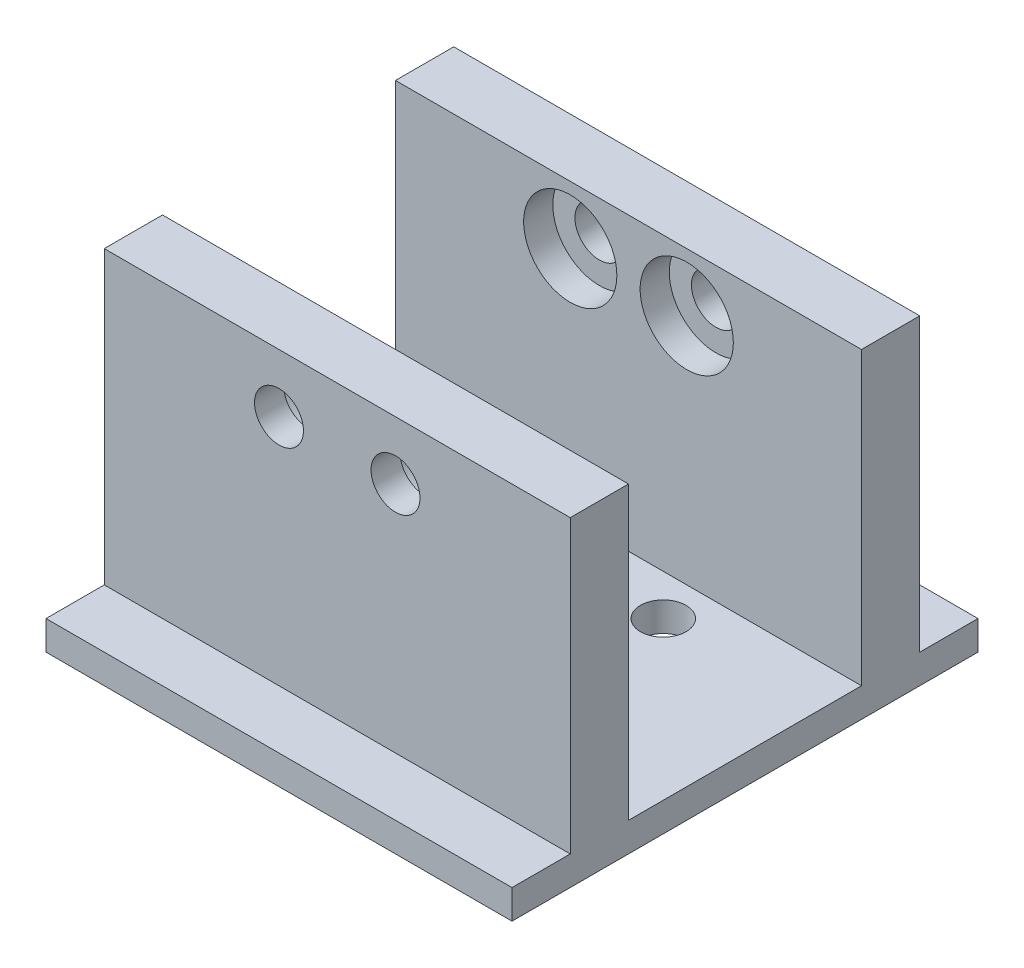
ISO-10303-21;
HEADER;
FILE_DESCRIPTION(('STEP AP214'),'2;1');
FILE_NAME('part.step','',(''),(''),'','','');
FILE_SCHEMA(('AUTOMOTIVE_DESIGN { 1 0 10303 214 1 1 1 1 }'));
ENDSEC;
DATA;
#1=APPLICATION_CONTEXT('core data for automotive mechanical design processes');
#2=APPLICATION_PROTOCOL_DEFINITION('international standard','automotive_design',2000,#1);
#3=PRODUCT_CONTEXT('',#1,'mechanical');
#4=PRODUCT('Part','Part','',(#3));
#5=PRODUCT_RELATED_PRODUCT_CATEGORY('part','',(#4));
#6=PRODUCT_DEFINITION_FORMATION('','',#4);
#7=PRODUCT_DEFINITION_CONTEXT('part definition',#1,'design');
#8=PRODUCT_DEFINITION('design','',#6,#7);
#9=PRODUCT_DEFINITION_SHAPE('','',#8);
#10=(LENGTH_UNIT() NAMED_UNIT(*) SI_UNIT(.MILLI.,.METRE.));
#11=(NAMED_UNIT(*) PLANE_ANGLE_UNIT() SI_UNIT($,.RADIAN.));
#12=(NAMED_UNIT(*) SI_UNIT($,.STERADIAN.) SOLID_ANGLE_UNIT());
#13=UNCERTAINTY_MEASURE_WITH_UNIT(LENGTH_MEASURE(1.E-05),#10,'distance_accuracy_value','');
#14=(GEOMETRIC_REPRESENTATION_CONTEXT(3) GLOBAL_UNCERTAINTY_ASSIGNED_CONTEXT((#13)) GLOBAL_UNIT_ASSIGNED_CONTEXT((#10,
#11,#12)) REPRESENTATION_CONTEXT('',''));
#15=CARTESIAN_POINT('',(0.,0.,0.));
#16=DIRECTION('',(0.,0.,1.));
#17=DIRECTION('',(1.,0.,0.));
#18=AXIS2_PLACEMENT_3D('',#15,#16,#17);
#19=CARTESIAN_POINT('',(-6.35,28.575,26.5934151416981));
#20=DIRECTION('',(0.,0.,-1.));
#21=DIRECTION('',(-1.,0.,0.));
#22=AXIS2_PLACEMENT_3D('',#19,#20,#21);
#23=CYLINDRICAL_SURFACE('',#22,2.667);
#24=CARTESIAN_POINT('',(-6.35,28.575,19.05));
#25=DIRECTION('',(0.,0.,-1.));
#26=DIRECTION('',(-1.,0.,0.));
#27=AXIS2_PLACEMENT_3D('',#24,#25,#26);
#28=CIRCLE('',#27,2.667);
#29=CARTESIAN_POINT('',(-9.017,28.575,19.05));
#30=VERTEX_POINT('',#29);
#31=EDGE_CURVE('E290',#30,#30,#28,.F.);
#32=ORIENTED_EDGE('',*,*,#31,.T.);
#33=EDGE_LOOP('',(#32));
#34=FACE_BOUND('',#33,.T.);
#35=CARTESIAN_POINT('',(-6.35,28.575,15.875));
#36=DIRECTION('',(0.,0.,-1.));
#37=DIRECTION('',(-1.,0.,0.));
#38=AXIS2_PLACEMENT_3D('',#35,#36,#37);
#39=CIRCLE('',#38,2.667);
#40=CARTESIAN_POINT('',(-9.017,28.575,15.875));
#41=VERTEX_POINT('',#40);
#42=EDGE_CURVE('E49',#41,#41,#39,.F.);
#43=ORIENTED_EDGE('',*,*,#42,.F.);
#44=EDGE_LOOP('',(#43));
#45=FACE_BOUND('',#44,.T.);
#46=ADVANCED_FACE('F45',(#34,#45),#23,.F.);
#47=CARTESIAN_POINT('',(6.35,28.575,26.5934151416981));
#48=DIRECTION('',(0.,0.,-1.));
#49=DIRECTION('',(-1.,0.,0.));
#50=AXIS2_PLACEMENT_3D('',#47,#48,#49);
#51=CYLINDRICAL_SURFACE('',#50,2.667);
#52=CARTESIAN_POINT('',(6.35,28.575,19.05));
#53=DIRECTION('',(0.,0.,-1.));
#54=DIRECTION('',(-1.,0.,0.));
#55=AXIS2_PLACEMENT_3D('',#52,#53,#54);
#56=CIRCLE('',#55,2.667);
#57=CARTESIAN_POINT('',(3.683,28.575,19.05));
#58=VERTEX_POINT('',#57);
#59=EDGE_CURVE('E289',#58,#58,#56,.F.);
#60=ORIENTED_EDGE('',*,*,#59,.T.);
#61=EDGE_LOOP('',(#60));
#62=FACE_BOUND('',#61,.T.);
#63=CARTESIAN_POINT('',(6.35,28.575,15.875));
#64=DIRECTION('',(0.,0.,-1.));
#65=DIRECTION('',(-1.,0.,0.));
#66=AXIS2_PLACEMENT_3D('',#63,#64,#65);
#67=CIRCLE('',#66,2.667);
#68=CARTESIAN_POINT('',(3.683,28.575,15.875));
#69=VERTEX_POINT('',#68);
#70=EDGE_CURVE('E255',#69,#69,#67,.F.);
#71=ORIENTED_EDGE('',*,*,#70,.F.);
#72=EDGE_LOOP('',(#71));
#73=FACE_BOUND('',#72,.T.);
#74=ADVANCED_FACE('F326',(#62,#73),#51,.F.);
#75=CARTESIAN_POINT('',(-6.35,28.575,-19.05));
#76=DIRECTION('',(0.,0.,-1.));
#77=DIRECTION('',(-1.,0.,0.));
#78=AXIS2_PLACEMENT_3D('',#75,#76,#77);
#79=CIRCLE('',#78,2.667);
#80=CARTESIAN_POINT('',(-9.017,28.575,-19.05));
#81=VERTEX_POINT('',#80);
#82=EDGE_CURVE('E254',#81,#81,#79,.T.);
#83=ORIENTED_EDGE('',*,*,#82,.T.);
#84=EDGE_LOOP('',(#83));
#85=FACE_BOUND('',#84,.T.);
#86=CARTESIAN_POINT('',(-6.35,28.575,-15.875));
#87=DIRECTION('',(0.,0.,1.));
#88=DIRECTION('',(1.,0.,0.));
#89=AXIS2_PLACEMENT_3D('',#86,#87,#88);
#90=CIRCLE('',#89,2.667);
#91=CARTESIAN_POINT('',(-3.683,28.575,-15.875));
#92=VERTEX_POINT('',#91);
#93=EDGE_CURVE('E251',#92,#92,#90,.F.);
#94=ORIENTED_EDGE('',*,*,#93,.F.);
#95=EDGE_LOOP('',(#94));
#96=FACE_BOUND('',#95,.T.);
#97=ADVANCED_FACE('F329',(#85,#96),#23,.F.);
#98=CARTESIAN_POINT('',(6.35,28.575,-19.05));
#99=DIRECTION('',(0.,0.,-1.));
#100=DIRECTION('',(-1.,0.,0.));
#101=AXIS2_PLACEMENT_3D('',#98,#99,#100);
#102=CIRCLE('',#101,2.667);
#103=CARTESIAN_POINT('',(3.683,28.575,-19.05));
#104=VERTEX_POINT('',#103);
#105=EDGE_CURVE('E286',#104,#104,#102,.T.);
#106=ORIENTED_EDGE('',*,*,#105,.T.);
#107=EDGE_LOOP('',(#106));
#108=FACE_BOUND('',#107,.T.);
#109=CARTESIAN_POINT('',(6.35,28.575,-15.875));
#110=DIRECTION('',(0.,0.,1.));
#111=DIRECTION('',(1.,0.,0.));
#112=AXIS2_PLACEMENT_3D('',#109,#110,#111);
#113=CIRCLE('',#112,2.667);
#114=CARTESIAN_POINT('',(9.017,28.575,-15.875));
#115=VERTEX_POINT('',#114);
#116=EDGE_CURVE('E248',#115,#115,#113,.F.);
#117=ORIENTED_EDGE('',*,*,#116,.F.);
#118=EDGE_LOOP('',(#117));
#119=FACE_BOUND('',#118,.T.);
#120=ADVANCED_FACE('F321',(#108,#119),#51,.F.);
#121=CARTESIAN_POINT('',(0.,3.175,0.));
#122=DIRECTION('',(0.,1.,0.));
#123=DIRECTION('',(0.,0.,1.));
#124=AXIS2_PLACEMENT_3D('',#121,#122,#123);
#125=PLANE('',#124);
#126=CARTESIAN_POINT('',(-8.24387511914144,3.175,8.24387511914148));
#127=DIRECTION('',(0.,1.,0.));
#128=DIRECTION('',(0.,0.,1.));
#129=AXIS2_PLACEMENT_3D('',#126,#127,#128);
#130=CIRCLE('',#129,2.4892);
#131=CARTESIAN_POINT('',(-8.24387511914144,3.175,10.7330751191415));
#132=VERTEX_POINT('',#131);
#133=EDGE_CURVE('E199',#132,#132,#130,.T.);
#134=ORIENTED_EDGE('',*,*,#133,.F.);
#135=EDGE_LOOP('',(#134));
#136=FACE_BOUND('',#135,.T.);
#137=CARTESIAN_POINT('',(8.24387511914145,3.175,-8.24387511914147));
#138=DIRECTION('',(0.,1.,0.));
#139=DIRECTION('',(0.,0.,1.));
#140=AXIS2_PLACEMENT_3D('',#137,#138,#139);
#141=CIRCLE('',#140,2.4892);
#142=CARTESIAN_POINT('',(8.24387511914145,3.175,-5.75467511914147));
#143=VERTEX_POINT('',#142);
#144=EDGE_CURVE('E211',#143,#143,#141,.T.);
#145=ORIENTED_EDGE('',*,*,#144,.F.);
#146=EDGE_LOOP('',(#145));
#147=FACE_BOUND('',#146,.T.);
#148=CARTESIAN_POINT('',(-8.24387511914145,3.175,-8.24387511914148));
#149=DIRECTION('',(0.,1.,0.));
#150=DIRECTION('',(0.,0.,1.));
#151=AXIS2_PLACEMENT_3D('',#148,#149,#150);
#152=CIRCLE('',#151,2.4892);
#153=CARTESIAN_POINT('',(-8.24387511914145,3.175,-5.75467511914148));
#154=VERTEX_POINT('',#153);
#155=EDGE_CURVE('E217',#154,#154,#152,.T.);
#156=ORIENTED_EDGE('',*,*,#155,.F.);
#157=EDGE_LOOP('',(#156));
#158=FACE_BOUND('',#157,.T.);
#159=CARTESIAN_POINT('',(8.24387511914143,3.175,8.24387511914146));
#160=DIRECTION('',(0.,1.,0.));
#161=DIRECTION('',(0.,0.,1.));
#162=AXIS2_PLACEMENT_3D('',#159,#160,#161);
#163=CIRCLE('',#162,2.4892);
#164=CARTESIAN_POINT('',(8.24387511914143,3.175,10.7330751191415));
#165=VERTEX_POINT('',#164);
#166=EDGE_CURVE('E205',#165,#165,#163,.T.);
#167=ORIENTED_EDGE('',*,*,#166,.F.);
#168=EDGE_LOOP('',(#167));
#169=FACE_BOUND('',#168,.T.);
#170=CARTESIAN_POINT('',(0.,3.175,0.));
#171=DIRECTION('',(0.,1.,0.));
#172=DIRECTION('',(0.,0.,1.));
#173=AXIS2_PLACEMENT_3D('',#170,#171,#172);
#174=CIRCLE('',#173,7.62);
#175=CARTESIAN_POINT('',(0.,3.175,7.62000000000001));
#176=VERTEX_POINT('',#175);
#177=EDGE_CURVE('E193',#176,#176,#174,.T.);
#178=ORIENTED_EDGE('',*,*,#177,.F.);
#179=EDGE_LOOP('',(#178));
#180=FACE_BOUND('',#179,.T.);
#181=DIRECTION('',(0.,0.,1.));
#182=VECTOR('',#181,1.);
#183=CARTESIAN_POINT('',(-25.3999999999999,3.175,-25.4));
#184=LINE('',#183,#182);
#185=CARTESIAN_POINT('',(-25.3999999999999,3.175,-12.7));
#186=VERTEX_POINT('',#185);
#187=CARTESIAN_POINT('',(-25.3999999999999,3.175,12.7));
#188=VERTEX_POINT('',#187);
#189=EDGE_CURVE('E231',#186,#188,#184,.T.);
#190=ORIENTED_EDGE('',*,*,#189,.T.);
#191=DIRECTION('',(-1.,0.,0.));
#192=VECTOR('',#191,1.);
#193=CARTESIAN_POINT('',(-25.3999999999999,3.175,12.7));
#194=LINE('',#193,#192);
#195=CARTESIAN_POINT('',(25.4000000000001,3.175,12.7));
#196=VERTEX_POINT('',#195);
#197=EDGE_CURVE('E62',#196,#188,#194,.T.);
#198=ORIENTED_EDGE('',*,*,#197,.F.);
#199=DIRECTION('',(0.,0.,-1.));
#200=VECTOR('',#199,1.);
#201=CARTESIAN_POINT('',(25.4000000000001,3.175,-25.4));
#202=LINE('',#201,#200);
#203=CARTESIAN_POINT('',(25.4000000000001,3.175,-12.7));
#204=VERTEX_POINT('',#203);
#205=EDGE_CURVE('E160',#196,#204,#202,.T.);
#206=ORIENTED_EDGE('',*,*,#205,.T.);
#207=DIRECTION('',(1.,0.,0.));
#208=VECTOR('',#207,1.);
#209=CARTESIAN_POINT('',(-25.3999999999999,3.175,-12.7));
#210=LINE('',#209,#208);
#211=EDGE_CURVE('E164',#186,#204,#210,.T.);
#212=ORIENTED_EDGE('',*,*,#211,.F.);
#213=EDGE_LOOP('',(#190,#198,#206,#212));
#214=FACE_BOUND('',#213,.T.);
#215=ADVANCED_FACE('F313',(#136,#147,#158,#169,#180,#214),#125,.T.);
#216=CARTESIAN_POINT('',(25.4000000000001,3.175,25.4));
#217=VERTEX_POINT('',#216);
#218=CARTESIAN_POINT('',(25.4000000000001,3.175,19.05));
#219=VERTEX_POINT('',#218);
#220=EDGE_CURVE('E70',#217,#219,#202,.T.);
#221=ORIENTED_EDGE('',*,*,#220,.T.);
#222=DIRECTION('',(1.,0.,0.));
#223=VECTOR('',#222,1.);
#224=CARTESIAN_POINT('',(-25.3999999999999,3.175,19.05));
#225=LINE('',#224,#223);
#226=CARTESIAN_POINT('',(-25.3999999999999,3.175,19.05));
#227=VERTEX_POINT('',#226);
#228=EDGE_CURVE('E156',#227,#219,#225,.T.);
#229=ORIENTED_EDGE('',*,*,#228,.F.);
#230=CARTESIAN_POINT('',(-25.3999999999999,3.175,25.4));
#231=VERTEX_POINT('',#230);
#232=EDGE_CURVE('E227',#227,#231,#184,.T.);
#233=ORIENTED_EDGE('',*,*,#232,.T.);
#234=DIRECTION('',(1.,0.,0.));
#235=VECTOR('',#234,1.);
#236=CARTESIAN_POINT('',(-25.3999999999999,3.175,25.4));
#237=LINE('',#236,#235);
#238=EDGE_CURVE('E230',#231,#217,#237,.T.);
#239=ORIENTED_EDGE('',*,*,#238,.T.);
#240=EDGE_LOOP('',(#221,#229,#233,#239));
#241=FACE_BOUND('',#240,.T.);
#242=ADVANCED_FACE('F310',(#241),#125,.T.);
#243=DIRECTION('',(-1.,0.,0.));
#244=VECTOR('',#243,1.);
#245=CARTESIAN_POINT('',(-25.3999999999999,3.175,-19.05));
#246=LINE('',#245,#244);
#247=CARTESIAN_POINT('',(25.4000000000001,3.175,-19.05));
#248=VERTEX_POINT('',#247);
#249=CARTESIAN_POINT('',(-25.3999999999999,3.175,-19.05));
#250=VERTEX_POINT('',#249);
#251=EDGE_CURVE('E161',#248,#250,#246,.T.);
#252=ORIENTED_EDGE('',*,*,#251,.F.);
#253=CARTESIAN_POINT('',(25.4000000000001,3.175,-25.4));
#254=VERTEX_POINT('',#253);
#255=EDGE_CURVE('E225',#248,#254,#202,.T.);
#256=ORIENTED_EDGE('',*,*,#255,.T.);
#257=DIRECTION('',(-1.,0.,0.));
#258=VECTOR('',#257,1.);
#259=CARTESIAN_POINT('',(-25.3999999999999,3.175,-25.4));
#260=LINE('',#259,#258);
#261=CARTESIAN_POINT('',(-25.3999999999999,3.175,-25.4));
#262=VERTEX_POINT('',#261);
#263=EDGE_CURVE('E224',#254,#262,#260,.T.);
#264=ORIENTED_EDGE('',*,*,#263,.T.);
#265=EDGE_CURVE('E228',#262,#250,#184,.T.);
#266=ORIENTED_EDGE('',*,*,#265,.T.);
#267=EDGE_LOOP('',(#252,#256,#264,#266));
#268=FACE_BOUND('',#267,.T.);
#269=ADVANCED_FACE('F312',(#268),#125,.T.);
#270=CARTESIAN_POINT('',(0.,0.,0.));
#271=DIRECTION('',(0.,1.,0.));
#272=DIRECTION('',(0.,0.,1.));
#273=AXIS2_PLACEMENT_3D('',#270,#271,#272);
#274=PLANE('',#273);
#275=DIRECTION('',(0.,0.,-1.));
#276=VECTOR('',#275,1.);
#277=CARTESIAN_POINT('',(25.4000000000001,0.,-25.4));
#278=LINE('',#277,#276);
#279=CARTESIAN_POINT('',(25.4000000000001,0.,25.4));
#280=VERTEX_POINT('',#279);
#281=CARTESIAN_POINT('',(25.4000000000001,0.,-25.4));
#282=VERTEX_POINT('',#281);
#283=EDGE_CURVE('E220',#280,#282,#278,.T.);
#284=ORIENTED_EDGE('',*,*,#283,.F.);
#285=DIRECTION('',(1.,0.,0.));
#286=VECTOR('',#285,1.);
#287=CARTESIAN_POINT('',(-25.3999999999999,0.,25.4));
#288=LINE('',#287,#286);
#289=CARTESIAN_POINT('',(-25.3999999999999,0.,25.4));
#290=VERTEX_POINT('',#289);
#291=EDGE_CURVE('E239',#290,#280,#288,.T.);
#292=ORIENTED_EDGE('',*,*,#291,.F.);
#293=DIRECTION('',(0.,0.,1.));
#294=VECTOR('',#293,1.);
#295=CARTESIAN_POINT('',(-25.3999999999999,0.,-25.4));
#296=LINE('',#295,#294);
#297=CARTESIAN_POINT('',(-25.3999999999999,0.,-25.4));
#298=VERTEX_POINT('',#297);
#299=EDGE_CURVE('E237',#298,#290,#296,.T.);
#300=ORIENTED_EDGE('',*,*,#299,.F.);
#301=DIRECTION('',(-1.,0.,0.));
#302=VECTOR('',#301,1.);
#303=CARTESIAN_POINT('',(-25.3999999999999,0.,-25.4));
#304=LINE('',#303,#302);
#305=EDGE_CURVE('E235',#282,#298,#304,.T.);
#306=ORIENTED_EDGE('',*,*,#305,.F.);
#307=EDGE_LOOP('',(#284,#292,#300,#306));
#308=FACE_BOUND('',#307,.T.);
#309=CARTESIAN_POINT('',(-8.24387511914145,0.,-8.24387511914148));
#310=DIRECTION('',(0.,1.,0.));
#311=DIRECTION('',(0.,0.,1.));
#312=AXIS2_PLACEMENT_3D('',#309,#310,#311);
#313=CIRCLE('',#312,2.4892);
#314=CARTESIAN_POINT('',(-8.24387511914145,0.,-5.75467511914148));
#315=VERTEX_POINT('',#314);
#316=EDGE_CURVE('E214',#315,#315,#313,.T.);
#317=ORIENTED_EDGE('',*,*,#316,.T.);
#318=EDGE_LOOP('',(#317));
#319=FACE_BOUND('',#318,.T.);
#320=CARTESIAN_POINT('',(8.24387511914145,0.,-8.24387511914147));
#321=DIRECTION('',(0.,1.,0.));
#322=DIRECTION('',(0.,0.,1.));
#323=AXIS2_PLACEMENT_3D('',#320,#321,#322);
#324=CIRCLE('',#323,2.4892);
#325=CARTESIAN_POINT('',(8.24387511914145,0.,-5.75467511914147));
#326=VERTEX_POINT('',#325);
#327=EDGE_CURVE('E208',#326,#326,#324,.T.);
#328=ORIENTED_EDGE('',*,*,#327,.T.);
#329=EDGE_LOOP('',(#328));
#330=FACE_BOUND('',#329,.T.);
#331=CARTESIAN_POINT('',(8.24387511914143,0.,8.24387511914146));
#332=DIRECTION('',(0.,1.,0.));
#333=DIRECTION('',(0.,0.,1.));
#334=AXIS2_PLACEMENT_3D('',#331,#332,#333);
#335=CIRCLE('',#334,2.4892);
#336=CARTESIAN_POINT('',(8.24387511914143,0.,10.7330751191415));
#337=VERTEX_POINT('',#336);
#338=EDGE_CURVE('E202',#337,#337,#335,.T.);
#339=ORIENTED_EDGE('',*,*,#338,.T.);
#340=EDGE_LOOP('',(#339));
#341=FACE_BOUND('',#340,.T.);
#342=CARTESIAN_POINT('',(-8.24387511914144,0.,8.24387511914148));
#343=DIRECTION('',(0.,1.,0.));
#344=DIRECTION('',(0.,0.,1.));
#345=AXIS2_PLACEMENT_3D('',#342,#343,#344);
#346=CIRCLE('',#345,2.4892);
#347=CARTESIAN_POINT('',(-8.24387511914144,0.,10.7330751191415));
#348=VERTEX_POINT('',#347);
#349=EDGE_CURVE('E196',#348,#348,#346,.T.);
#350=ORIENTED_EDGE('',*,*,#349,.T.);
#351=EDGE_LOOP('',(#350));
#352=FACE_BOUND('',#351,.T.);
#353=CARTESIAN_POINT('',(0.,0.,0.));
#354=DIRECTION('',(0.,1.,0.));
#355=DIRECTION('',(0.,0.,1.));
#356=AXIS2_PLACEMENT_3D('',#353,#354,#355);
#357=CIRCLE('',#356,7.62);
#358=CARTESIAN_POINT('',(0.,0.,7.62000000000001));
#359=VERTEX_POINT('',#358);
#360=EDGE_CURVE('E192',#359,#359,#357,.T.);
#361=ORIENTED_EDGE('',*,*,#360,.T.);
#362=EDGE_LOOP('',(#361));
#363=FACE_BOUND('',#362,.T.);
#364=ADVANCED_FACE('F319',(#308,#319,#330,#341,#352,#363),#274,.F.);
#365=CARTESIAN_POINT('',(25.4000000000001,3.175,-25.4));
#366=DIRECTION('',(-1.,0.,0.));
#367=DIRECTION('',(0.,0.,1.));
#368=AXIS2_PLACEMENT_3D('',#365,#366,#367);
#369=PLANE('',#368);
#370=ORIENTED_EDGE('',*,*,#283,.T.);
#371=DIRECTION('',(0.,-1.,0.));
#372=VECTOR('',#371,1.);
#373=CARTESIAN_POINT('',(25.4000000000001,3.175,-25.4));
#374=LINE('',#373,#372);
#375=EDGE_CURVE('E11',#254,#282,#374,.T.);
#376=ORIENTED_EDGE('',*,*,#375,.F.);
#377=ORIENTED_EDGE('',*,*,#255,.F.);
#378=DIRECTION('',(0.,-1.,0.));
#379=VECTOR('',#378,1.);
#380=CARTESIAN_POINT('',(25.4000000000001,34.925,-19.05));
#381=LINE('',#380,#379);
#382=CARTESIAN_POINT('',(25.4000000000001,34.925,-19.05));
#383=VERTEX_POINT('',#382);
#384=EDGE_CURVE('E189',#383,#248,#381,.T.);
#385=ORIENTED_EDGE('',*,*,#384,.F.);
#386=DIRECTION('',(0.,0.,-1.));
#387=VECTOR('',#386,1.);
#388=CARTESIAN_POINT('',(25.4000000000001,34.925,-19.05));
#389=LINE('',#388,#387);
#390=CARTESIAN_POINT('',(25.4000000000001,34.925,-12.7));
#391=VERTEX_POINT('',#390);
#392=EDGE_CURVE('E170',#391,#383,#389,.T.);
#393=ORIENTED_EDGE('',*,*,#392,.F.);
#394=DIRECTION('',(0.,-1.,0.));
#395=VECTOR('',#394,1.);
#396=CARTESIAN_POINT('',(25.4000000000001,34.925,-12.7));
#397=LINE('',#396,#395);
#398=EDGE_CURVE('E178',#391,#204,#397,.T.);
#399=ORIENTED_EDGE('',*,*,#398,.T.);
#400=ORIENTED_EDGE('',*,*,#205,.F.);
#401=DIRECTION('',(0.,-1.,0.));
#402=VECTOR('',#401,1.);
#403=CARTESIAN_POINT('',(25.4000000000001,34.925,12.7));
#404=LINE('',#403,#402);
#405=CARTESIAN_POINT('',(25.4000000000001,34.925,12.7));
#406=VERTEX_POINT('',#405);
#407=EDGE_CURVE('E141',#406,#196,#404,.T.);
#408=ORIENTED_EDGE('',*,*,#407,.F.);
#409=DIRECTION('',(0.,0.,-1.));
#410=VECTOR('',#409,1.);
#411=CARTESIAN_POINT('',(25.4000000000001,34.925,12.7));
#412=LINE('',#411,#410);
#413=CARTESIAN_POINT('',(25.4000000000001,34.925,19.05));
#414=VERTEX_POINT('',#413);
#415=EDGE_CURVE('E147',#414,#406,#412,.T.);
#416=ORIENTED_EDGE('',*,*,#415,.F.);
#417=DIRECTION('',(0.,-1.,0.));
#418=VECTOR('',#417,1.);
#419=CARTESIAN_POINT('',(25.4000000000001,34.925,19.05));
#420=LINE('',#419,#418);
#421=EDGE_CURVE('E299',#414,#219,#420,.T.);
#422=ORIENTED_EDGE('',*,*,#421,.T.);
#423=ORIENTED_EDGE('',*,*,#220,.F.);
#424=DIRECTION('',(0.,-1.,0.));
#425=VECTOR('',#424,1.);
#426=CARTESIAN_POINT('',(25.4000000000001,3.175,25.4));
#427=LINE('',#426,#425);
#428=EDGE_CURVE('E233',#217,#280,#427,.T.);
#429=ORIENTED_EDGE('',*,*,#428,.T.);
#430=EDGE_LOOP('',(#370,#376,#377,#385,#393,#399,#400,#408,#416,#422,#423,#429));
#431=FACE_BOUND('',#430,.T.);
#432=ADVANCED_FACE('F47',(#431),#369,.F.);
#433=CARTESIAN_POINT('',(-25.3999999999999,3.175,-25.4));
#434=DIRECTION('',(0.,0.,1.));
#435=DIRECTION('',(1.,0.,0.));
#436=AXIS2_PLACEMENT_3D('',#433,#434,#435);
#437=PLANE('',#436);
#438=ORIENTED_EDGE('',*,*,#305,.T.);
#439=DIRECTION('',(0.,-1.,0.));
#440=VECTOR('',#439,1.);
#441=CARTESIAN_POINT('',(-25.3999999999999,3.175,-25.4));
#442=LINE('',#441,#440);
#443=EDGE_CURVE('E54',#262,#298,#442,.T.);
#444=ORIENTED_EDGE('',*,*,#443,.F.);
#445=ORIENTED_EDGE('',*,*,#263,.F.);
#446=ORIENTED_EDGE('',*,*,#375,.T.);
#447=EDGE_LOOP('',(#438,#444,#445,#446));
#448=FACE_BOUND('',#447,.T.);
#449=ADVANCED_FACE('F402',(#448),#437,.F.);
#450=CARTESIAN_POINT('',(-25.3999999999999,3.175,-25.4));
#451=DIRECTION('',(1.,0.,0.));
#452=DIRECTION('',(0.,0.,-1.));
#453=AXIS2_PLACEMENT_3D('',#450,#451,#452);
#454=PLANE('',#453);
#455=ORIENTED_EDGE('',*,*,#299,.T.);
#456=DIRECTION('',(0.,-1.,0.));
#457=VECTOR('',#456,1.);
#458=CARTESIAN_POINT('',(-25.3999999999999,3.175,25.4));
#459=LINE('',#458,#457);
#460=EDGE_CURVE('E243',#231,#290,#459,.T.);
#461=ORIENTED_EDGE('',*,*,#460,.F.);
#462=ORIENTED_EDGE('',*,*,#232,.F.);
#463=DIRECTION('',(0.,-1.,0.));
#464=VECTOR('',#463,1.);
#465=CARTESIAN_POINT('',(-25.3999999999999,34.925,19.05));
#466=LINE('',#465,#464);
#467=CARTESIAN_POINT('',(-25.3999999999999,34.925,19.05));
#468=VERTEX_POINT('',#467);
#469=EDGE_CURVE('E166',#468,#227,#466,.T.);
#470=ORIENTED_EDGE('',*,*,#469,.F.);
#471=DIRECTION('',(0.,0.,1.));
#472=VECTOR('',#471,1.);
#473=CARTESIAN_POINT('',(-25.3999999999999,34.925,12.7));
#474=LINE('',#473,#472);
#475=CARTESIAN_POINT('',(-25.3999999999999,34.925,12.7));
#476=VERTEX_POINT('',#475);
#477=EDGE_CURVE('E146',#476,#468,#474,.T.);
#478=ORIENTED_EDGE('',*,*,#477,.F.);
#479=DIRECTION('',(0.,-1.,0.));
#480=VECTOR('',#479,1.);
#481=CARTESIAN_POINT('',(-25.3999999999999,34.925,12.7));
#482=LINE('',#481,#480);
#483=EDGE_CURVE('E143',#476,#188,#482,.T.);
#484=ORIENTED_EDGE('',*,*,#483,.T.);
#485=ORIENTED_EDGE('',*,*,#189,.F.);
#486=DIRECTION('',(0.,-1.,0.));
#487=VECTOR('',#486,1.);
#488=CARTESIAN_POINT('',(-25.3999999999999,34.925,-12.7));
#489=LINE('',#488,#487);
#490=CARTESIAN_POINT('',(-25.3999999999999,34.925,-12.7));
#491=VERTEX_POINT('',#490);
#492=EDGE_CURVE('E183',#491,#186,#489,.T.);
#493=ORIENTED_EDGE('',*,*,#492,.F.);
#494=DIRECTION('',(0.,0.,1.));
#495=VECTOR('',#494,1.);
#496=CARTESIAN_POINT('',(-25.3999999999999,34.925,-19.05));
#497=LINE('',#496,#495);
#498=CARTESIAN_POINT('',(-25.3999999999999,34.925,-19.05));
#499=VERTEX_POINT('',#498);
#500=EDGE_CURVE('E175',#499,#491,#497,.T.);
#501=ORIENTED_EDGE('',*,*,#500,.F.);
#502=DIRECTION('',(0.,-1.,0.));
#503=VECTOR('',#502,1.);
#504=CARTESIAN_POINT('',(-25.3999999999999,34.925,-19.05));
#505=LINE('',#504,#503);
#506=EDGE_CURVE('E186',#499,#250,#505,.T.);
#507=ORIENTED_EDGE('',*,*,#506,.T.);
#508=ORIENTED_EDGE('',*,*,#265,.F.);
#509=ORIENTED_EDGE('',*,*,#443,.T.);
#510=EDGE_LOOP('',(#455,#461,#462,#470,#478,#484,#485,#493,#501,#507,#508,#509));
#511=FACE_BOUND('',#510,.T.);
#512=ADVANCED_FACE('F307',(#511),#454,.F.);
#513=CARTESIAN_POINT('',(-25.3999999999999,3.175,25.4));
#514=DIRECTION('',(0.,0.,-1.));
#515=DIRECTION('',(-1.,0.,0.));
#516=AXIS2_PLACEMENT_3D('',#513,#514,#515);
#517=PLANE('',#516);
#518=ORIENTED_EDGE('',*,*,#291,.T.);
#519=ORIENTED_EDGE('',*,*,#428,.F.);
#520=ORIENTED_EDGE('',*,*,#238,.F.);
#521=ORIENTED_EDGE('',*,*,#460,.T.);
#522=EDGE_LOOP('',(#518,#519,#520,#521));
#523=FACE_BOUND('',#522,.T.);
#524=ADVANCED_FACE('F410',(#523),#517,.F.);
#525=CARTESIAN_POINT('',(-8.24387511914145,3.175,-8.24387511914148));
#526=DIRECTION('',(0.,-1.,0.));
#527=DIRECTION('',(0.,0.,-1.));
#528=AXIS2_PLACEMENT_3D('',#525,#526,#527);
#529=CYLINDRICAL_SURFACE('',#528,2.4892);
#530=ORIENTED_EDGE('',*,*,#155,.T.);
#531=EDGE_LOOP('',(#530));
#532=FACE_BOUND('',#531,.T.);
#533=ORIENTED_EDGE('',*,*,#316,.F.);
#534=EDGE_LOOP('',(#533));
#535=FACE_BOUND('',#534,.T.);
#536=ADVANCED_FACE('F412',(#532,#535),#529,.F.);
#537=CARTESIAN_POINT('',(8.24387511914145,3.175,-8.24387511914147));
#538=DIRECTION('',(0.,-1.,0.));
#539=DIRECTION('',(0.,0.,-1.));
#540=AXIS2_PLACEMENT_3D('',#537,#538,#539);
#541=CYLINDRICAL_SURFACE('',#540,2.4892);
#542=ORIENTED_EDGE('',*,*,#144,.T.);
#543=EDGE_LOOP('',(#542));
#544=FACE_BOUND('',#543,.T.);
#545=ORIENTED_EDGE('',*,*,#327,.F.);
#546=EDGE_LOOP('',(#545));
#547=FACE_BOUND('',#546,.T.);
#548=ADVANCED_FACE('F418',(#544,#547),#541,.F.);
#549=CARTESIAN_POINT('',(8.24387511914143,3.175,8.24387511914146));
#550=DIRECTION('',(0.,-1.,0.));
#551=DIRECTION('',(0.,0.,-1.));
#552=AXIS2_PLACEMENT_3D('',#549,#550,#551);
#553=CYLINDRICAL_SURFACE('',#552,2.4892);
#554=ORIENTED_EDGE('',*,*,#166,.T.);
#555=EDGE_LOOP('',(#554));
#556=FACE_BOUND('',#555,.T.);
#557=ORIENTED_EDGE('',*,*,#338,.F.);
#558=EDGE_LOOP('',(#557));
#559=FACE_BOUND('',#558,.T.);
#560=ADVANCED_FACE('F463',(#556,#559),#553,.F.);
#561=CARTESIAN_POINT('',(-8.24387511914144,3.175,8.24387511914148));
#562=DIRECTION('',(0.,-1.,0.));
#563=DIRECTION('',(0.,0.,-1.));
#564=AXIS2_PLACEMENT_3D('',#561,#562,#563);
#565=CYLINDRICAL_SURFACE('',#564,2.4892);
#566=ORIENTED_EDGE('',*,*,#133,.T.);
#567=EDGE_LOOP('',(#566));
#568=FACE_BOUND('',#567,.T.);
#569=ORIENTED_EDGE('',*,*,#349,.F.);
#570=EDGE_LOOP('',(#569));
#571=FACE_BOUND('',#570,.T.);
#572=ADVANCED_FACE('F472',(#568,#571),#565,.F.);
#573=CARTESIAN_POINT('',(0.,3.175,0.));
#574=DIRECTION('',(0.,-1.,0.));
#575=DIRECTION('',(0.,0.,-1.));
#576=AXIS2_PLACEMENT_3D('',#573,#574,#575);
#577=CYLINDRICAL_SURFACE('',#576,7.62);
#578=ORIENTED_EDGE('',*,*,#177,.T.);
#579=EDGE_LOOP('',(#578));
#580=FACE_BOUND('',#579,.T.);
#581=ORIENTED_EDGE('',*,*,#360,.F.);
#582=EDGE_LOOP('',(#581));
#583=FACE_BOUND('',#582,.T.);
#584=ADVANCED_FACE('F481',(#580,#583),#577,.F.);
#585=CARTESIAN_POINT('',(-25.3999999999999,34.925,-19.05));
#586=DIRECTION('',(0.,0.,1.));
#587=DIRECTION('',(1.,0.,0.));
#588=AXIS2_PLACEMENT_3D('',#585,#586,#587);
#589=PLANE('',#588);
#590=ORIENTED_EDGE('',*,*,#105,.F.);
#591=EDGE_LOOP('',(#590));
#592=FACE_BOUND('',#591,.T.);
#593=ORIENTED_EDGE('',*,*,#82,.F.);
#594=EDGE_LOOP('',(#593));
#595=FACE_BOUND('',#594,.T.);
#596=ORIENTED_EDGE('',*,*,#251,.T.);
#597=ORIENTED_EDGE('',*,*,#506,.F.);
#598=DIRECTION('',(-1.,0.,0.));
#599=VECTOR('',#598,1.);
#600=CARTESIAN_POINT('',(-25.3999999999999,34.925,-19.05));
#601=LINE('',#600,#599);
#602=EDGE_CURVE('E173',#383,#499,#601,.T.);
#603=ORIENTED_EDGE('',*,*,#602,.F.);
#604=ORIENTED_EDGE('',*,*,#384,.T.);
#605=EDGE_LOOP('',(#596,#597,#603,#604));
#606=FACE_BOUND('',#605,.T.);
#607=ADVANCED_FACE('F383',(#592,#595,#606),#589,.F.);
#608=CARTESIAN_POINT('',(-25.3999999999999,34.925,-12.7));
#609=DIRECTION('',(0.,0.,-1.));
#610=DIRECTION('',(-1.,0.,0.));
#611=AXIS2_PLACEMENT_3D('',#608,#609,#610);
#612=PLANE('',#611);
#613=CARTESIAN_POINT('',(-6.35,28.575,-12.7));
#614=DIRECTION('',(0.,0.,1.));
#615=DIRECTION('',(1.,0.,0.));
#616=AXIS2_PLACEMENT_3D('',#613,#614,#615);
#617=CIRCLE('',#616,5.08);
#618=CARTESIAN_POINT('',(-1.27,28.575,-12.7));
#619=VERTEX_POINT('',#618);
#620=EDGE_CURVE('E278',#619,#619,#617,.T.);
#621=ORIENTED_EDGE('',*,*,#620,.F.);
#622=EDGE_LOOP('',(#621));
#623=FACE_BOUND('',#622,.T.);
#624=CARTESIAN_POINT('',(6.35,28.575,-12.7));
#625=DIRECTION('',(0.,0.,1.));
#626=DIRECTION('',(1.,0.,0.));
#627=AXIS2_PLACEMENT_3D('',#624,#625,#626);
#628=CIRCLE('',#627,5.08);
#629=CARTESIAN_POINT('',(11.43,28.575,-12.7));
#630=VERTEX_POINT('',#629);
#631=EDGE_CURVE('E261',#630,#630,#628,.T.);
#632=ORIENTED_EDGE('',*,*,#631,.F.);
#633=EDGE_LOOP('',(#632));
#634=FACE_BOUND('',#633,.T.);
#635=ORIENTED_EDGE('',*,*,#211,.T.);
#636=ORIENTED_EDGE('',*,*,#398,.F.);
#637=DIRECTION('',(1.,0.,0.));
#638=VECTOR('',#637,1.);
#639=CARTESIAN_POINT('',(-25.3999999999999,34.925,-12.7));
#640=LINE('',#639,#638);
#641=EDGE_CURVE('E177',#491,#391,#640,.T.);
#642=ORIENTED_EDGE('',*,*,#641,.F.);
#643=ORIENTED_EDGE('',*,*,#492,.T.);
#644=EDGE_LOOP('',(#635,#636,#642,#643));
#645=FACE_BOUND('',#644,.T.);
#646=ADVANCED_FACE('F379',(#623,#634,#645),#612,.F.);
#647=CARTESIAN_POINT('',(0.,34.925,0.));
#648=DIRECTION('',(0.,1.,0.));
#649=DIRECTION('',(0.,0.,1.));
#650=AXIS2_PLACEMENT_3D('',#647,#648,#649);
#651=PLANE('',#650);
#652=ORIENTED_EDGE('',*,*,#392,.T.);
#653=ORIENTED_EDGE('',*,*,#602,.T.);
#654=ORIENTED_EDGE('',*,*,#500,.T.);
#655=ORIENTED_EDGE('',*,*,#641,.T.);
#656=EDGE_LOOP('',(#652,#653,#654,#655));
#657=FACE_BOUND('',#656,.T.);
#658=ADVANCED_FACE('F382',(#657),#651,.T.);
#659=CARTESIAN_POINT('',(-25.3999999999999,34.925,12.7));
#660=DIRECTION('',(0.,0.,1.));
#661=DIRECTION('',(1.,0.,0.));
#662=AXIS2_PLACEMENT_3D('',#659,#660,#661);
#663=PLANE('',#662);
#664=CARTESIAN_POINT('',(6.35,28.575,12.7));
#665=DIRECTION('',(0.,0.,-1.));
#666=DIRECTION('',(-1.,0.,0.));
#667=AXIS2_PLACEMENT_3D('',#664,#665,#666);
#668=CIRCLE('',#667,5.08);
#669=CARTESIAN_POINT('',(1.27,28.575,12.7));
#670=VERTEX_POINT('',#669);
#671=EDGE_CURVE('E263',#670,#670,#668,.T.);
#672=ORIENTED_EDGE('',*,*,#671,.F.);
#673=EDGE_LOOP('',(#672));
#674=FACE_BOUND('',#673,.T.);
#675=CARTESIAN_POINT('',(-6.35,28.575,12.7));
#676=DIRECTION('',(0.,0.,-1.));
#677=DIRECTION('',(-1.,0.,0.));
#678=AXIS2_PLACEMENT_3D('',#675,#676,#677);
#679=CIRCLE('',#678,5.08);
#680=CARTESIAN_POINT('',(-11.43,28.575,12.7));
#681=VERTEX_POINT('',#680);
#682=EDGE_CURVE('E273',#681,#681,#679,.T.);
#683=ORIENTED_EDGE('',*,*,#682,.F.);
#684=EDGE_LOOP('',(#683));
#685=FACE_BOUND('',#684,.T.);
#686=ORIENTED_EDGE('',*,*,#197,.T.);
#687=ORIENTED_EDGE('',*,*,#483,.F.);
#688=DIRECTION('',(-1.,0.,0.));
#689=VECTOR('',#688,1.);
#690=CARTESIAN_POINT('',(-25.3999999999999,34.925,12.7));
#691=LINE('',#690,#689);
#692=EDGE_CURVE('E137',#406,#476,#691,.T.);
#693=ORIENTED_EDGE('',*,*,#692,.F.);
#694=ORIENTED_EDGE('',*,*,#407,.T.);
#695=EDGE_LOOP('',(#686,#687,#693,#694));
#696=FACE_BOUND('',#695,.T.);
#697=ADVANCED_FACE('F139',(#674,#685,#696),#663,.F.);
#698=CARTESIAN_POINT('',(-25.3999999999999,34.925,19.05));
#699=DIRECTION('',(0.,0.,-1.));
#700=DIRECTION('',(-1.,0.,0.));
#701=AXIS2_PLACEMENT_3D('',#698,#699,#700);
#702=PLANE('',#701);
#703=ORIENTED_EDGE('',*,*,#59,.F.);
#704=EDGE_LOOP('',(#703));
#705=FACE_BOUND('',#704,.T.);
#706=ORIENTED_EDGE('',*,*,#31,.F.);
#707=EDGE_LOOP('',(#706));
#708=FACE_BOUND('',#707,.T.);
#709=ORIENTED_EDGE('',*,*,#228,.T.);
#710=ORIENTED_EDGE('',*,*,#421,.F.);
#711=DIRECTION('',(1.,0.,0.));
#712=VECTOR('',#711,1.);
#713=CARTESIAN_POINT('',(-25.3999999999999,34.925,19.05));
#714=LINE('',#713,#712);
#715=EDGE_CURVE('E152',#468,#414,#714,.T.);
#716=ORIENTED_EDGE('',*,*,#715,.F.);
#717=ORIENTED_EDGE('',*,*,#469,.T.);
#718=EDGE_LOOP('',(#709,#710,#716,#717));
#719=FACE_BOUND('',#718,.T.);
#720=ADVANCED_FACE('F305',(#705,#708,#719),#702,.F.);
#721=CARTESIAN_POINT('',(0.,34.925,0.));
#722=DIRECTION('',(0.,1.,0.));
#723=DIRECTION('',(0.,0.,1.));
#724=AXIS2_PLACEMENT_3D('',#721,#722,#723);
#725=PLANE('',#724);
#726=ORIENTED_EDGE('',*,*,#415,.T.);
#727=ORIENTED_EDGE('',*,*,#692,.T.);
#728=ORIENTED_EDGE('',*,*,#477,.T.);
#729=ORIENTED_EDGE('',*,*,#715,.T.);
#730=EDGE_LOOP('',(#726,#727,#728,#729));
#731=FACE_BOUND('',#730,.T.);
#732=ADVANCED_FACE('F150',(#731),#725,.T.);
#733=CARTESIAN_POINT('',(6.35,28.575,-15.875));
#734=DIRECTION('',(0.,0.,1.));
#735=DIRECTION('',(1.,0.,0.));
#736=AXIS2_PLACEMENT_3D('',#733,#734,#735);
#737=PLANE('',#736);
#738=CARTESIAN_POINT('',(6.35,28.575,-15.875));
#739=DIRECTION('',(0.,0.,1.));
#740=DIRECTION('',(1.,0.,0.));
#741=AXIS2_PLACEMENT_3D('',#738,#739,#740);
#742=CIRCLE('',#741,5.08);
#743=CARTESIAN_POINT('',(11.43,28.575,-15.875));
#744=VERTEX_POINT('',#743);
#745=EDGE_CURVE('E281',#744,#744,#742,.T.);
#746=ORIENTED_EDGE('',*,*,#745,.T.);
#747=EDGE_LOOP('',(#746));
#748=FACE_BOUND('',#747,.T.);
#749=ORIENTED_EDGE('',*,*,#116,.T.);
#750=EDGE_LOOP('',(#749));
#751=FACE_BOUND('',#750,.T.);
#752=ADVANCED_FACE('F360',(#748,#751),#737,.T.);
#753=CARTESIAN_POINT('',(6.35,28.575,-15.875));
#754=DIRECTION('',(0.,0.,1.));
#755=DIRECTION('',(1.,0.,0.));
#756=AXIS2_PLACEMENT_3D('',#753,#754,#755);
#757=CYLINDRICAL_SURFACE('',#756,5.08);
#758=ORIENTED_EDGE('',*,*,#745,.F.);
#759=EDGE_LOOP('',(#758));
#760=FACE_BOUND('',#759,.T.);
#761=ORIENTED_EDGE('',*,*,#631,.T.);
#762=EDGE_LOOP('',(#761));
#763=FACE_BOUND('',#762,.T.);
#764=ADVANCED_FACE('F350',(#760,#763),#757,.F.);
#765=CARTESIAN_POINT('',(-6.35,28.575,-15.875));
#766=DIRECTION('',(0.,0.,1.));
#767=DIRECTION('',(1.,0.,0.));
#768=AXIS2_PLACEMENT_3D('',#765,#766,#767);
#769=PLANE('',#768);
#770=CARTESIAN_POINT('',(-6.35,28.575,-15.875));
#771=DIRECTION('',(0.,0.,1.));
#772=DIRECTION('',(1.,0.,0.));
#773=AXIS2_PLACEMENT_3D('',#770,#771,#772);
#774=CIRCLE('',#773,5.08);
#775=CARTESIAN_POINT('',(-1.27,28.575,-15.875));
#776=VERTEX_POINT('',#775);
#777=EDGE_CURVE('E252',#776,#776,#774,.T.);
#778=ORIENTED_EDGE('',*,*,#777,.T.);
#779=EDGE_LOOP('',(#778));
#780=FACE_BOUND('',#779,.T.);
#781=ORIENTED_EDGE('',*,*,#93,.T.);
#782=EDGE_LOOP('',(#781));
#783=FACE_BOUND('',#782,.T.);
#784=ADVANCED_FACE('F347',(#780,#783),#769,.T.);
#785=CARTESIAN_POINT('',(-6.35,28.575,-15.875));
#786=DIRECTION('',(0.,0.,1.));
#787=DIRECTION('',(1.,0.,0.));
#788=AXIS2_PLACEMENT_3D('',#785,#786,#787);
#789=CYLINDRICAL_SURFACE('',#788,5.08);
#790=ORIENTED_EDGE('',*,*,#777,.F.);
#791=EDGE_LOOP('',(#790));
#792=FACE_BOUND('',#791,.T.);
#793=ORIENTED_EDGE('',*,*,#620,.T.);
#794=EDGE_LOOP('',(#793));
#795=FACE_BOUND('',#794,.T.);
#796=ADVANCED_FACE('F349',(#792,#795),#789,.F.);
#797=CARTESIAN_POINT('',(6.35,28.575,15.875));
#798=DIRECTION('',(0.,0.,-1.));
#799=DIRECTION('',(-1.,0.,0.));
#800=AXIS2_PLACEMENT_3D('',#797,#798,#799);
#801=PLANE('',#800);
#802=CARTESIAN_POINT('',(6.35,28.575,15.875));
#803=DIRECTION('',(0.,0.,-1.));
#804=DIRECTION('',(-1.,0.,0.));
#805=AXIS2_PLACEMENT_3D('',#802,#803,#804);
#806=CIRCLE('',#805,5.08);
#807=CARTESIAN_POINT('',(1.27,28.575,15.875));
#808=VERTEX_POINT('',#807);
#809=EDGE_CURVE('E257',#808,#808,#806,.T.);
#810=ORIENTED_EDGE('',*,*,#809,.T.);
#811=EDGE_LOOP('',(#810));
#812=FACE_BOUND('',#811,.T.);
#813=ORIENTED_EDGE('',*,*,#70,.T.);
#814=EDGE_LOOP('',(#813));
#815=FACE_BOUND('',#814,.T.);
#816=ADVANCED_FACE('F357',(#812,#815),#801,.T.);
#817=CARTESIAN_POINT('',(6.35,28.575,15.875));
#818=DIRECTION('',(0.,0.,-1.));
#819=DIRECTION('',(-1.,0.,0.));
#820=AXIS2_PLACEMENT_3D('',#817,#818,#819);
#821=CYLINDRICAL_SURFACE('',#820,5.08);
#822=ORIENTED_EDGE('',*,*,#809,.F.);
#823=EDGE_LOOP('',(#822));
#824=FACE_BOUND('',#823,.T.);
#825=ORIENTED_EDGE('',*,*,#671,.T.);
#826=EDGE_LOOP('',(#825));
#827=FACE_BOUND('',#826,.T.);
#828=ADVANCED_FACE('F534',(#824,#827),#821,.F.);
#829=CARTESIAN_POINT('',(-6.35,28.575,15.875));
#830=DIRECTION('',(0.,0.,-1.));
#831=DIRECTION('',(-1.,0.,0.));
#832=AXIS2_PLACEMENT_3D('',#829,#830,#831);
#833=PLANE('',#832);
#834=CARTESIAN_POINT('',(-6.35,28.575,15.875));
#835=DIRECTION('',(0.,0.,-1.));
#836=DIRECTION('',(-1.,0.,0.));
#837=AXIS2_PLACEMENT_3D('',#834,#835,#836);
#838=CIRCLE('',#837,5.08);
#839=CARTESIAN_POINT('',(-11.43,28.575,15.875));
#840=VERTEX_POINT('',#839);
#841=EDGE_CURVE('E268',#840,#840,#838,.T.);
#842=ORIENTED_EDGE('',*,*,#841,.T.);
#843=EDGE_LOOP('',(#842));
#844=FACE_BOUND('',#843,.T.);
#845=ORIENTED_EDGE('',*,*,#42,.T.);
#846=EDGE_LOOP('',(#845));
#847=FACE_BOUND('',#846,.T.);
#848=ADVANCED_FACE('F542',(#844,#847),#833,.T.);
#849=CARTESIAN_POINT('',(-6.35,28.575,15.875));
#850=DIRECTION('',(0.,0.,-1.));
#851=DIRECTION('',(-1.,0.,0.));
#852=AXIS2_PLACEMENT_3D('',#849,#850,#851);
#853=CYLINDRICAL_SURFACE('',#852,5.08);
#854=ORIENTED_EDGE('',*,*,#841,.F.);
#855=EDGE_LOOP('',(#854));
#856=FACE_BOUND('',#855,.T.);
#857=ORIENTED_EDGE('',*,*,#682,.T.);
#858=EDGE_LOOP('',(#857));
#859=FACE_BOUND('',#858,.T.);
#860=ADVANCED_FACE('F364',(#856,#859),#853,.F.);
#861=CLOSED_SHELL('',(#46,#74,#97,#120,#215,#242,#269,#364,#432,#449,#512,#524,#536,#548,#560,
#572,#584,#607,#646,#658,#697,#720,#732,#752,#764,#784,#796,#816,#828,#848,#860));
#862=MANIFOLD_SOLID_BREP('B2',#861);
#863=ADVANCED_BREP_SHAPE_REPRESENTATION('',(#18,#862),#14);
#864=SHAPE_DEFINITION_REPRESENTATION(#9,#863);
ENDSEC;
END-ISO-10303-21;
